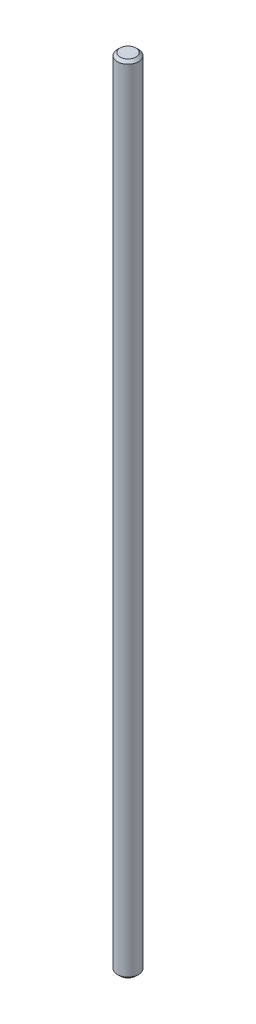
ISO-10303-21;
HEADER;
FILE_DESCRIPTION(('STEP AP214'),'2;1');
FILE_NAME('part.step','',(''),(''),'','','');
FILE_SCHEMA(('AUTOMOTIVE_DESIGN { 1 0 10303 214 1 1 1 1 }'));
ENDSEC;
DATA;
#1=APPLICATION_CONTEXT('core data for automotive mechanical design processes');
#2=APPLICATION_PROTOCOL_DEFINITION('international standard','automotive_design',2000,#1);
#3=PRODUCT_CONTEXT('',#1,'mechanical');
#4=PRODUCT('Part','Part','',(#3));
#5=PRODUCT_RELATED_PRODUCT_CATEGORY('part','',(#4));
#6=PRODUCT_DEFINITION_FORMATION('','',#4);
#7=PRODUCT_DEFINITION_CONTEXT('part definition',#1,'design');
#8=PRODUCT_DEFINITION('design','',#6,#7);
#9=PRODUCT_DEFINITION_SHAPE('','',#8);
#10=(LENGTH_UNIT() NAMED_UNIT(*) SI_UNIT(.MILLI.,.METRE.));
#11=(NAMED_UNIT(*) PLANE_ANGLE_UNIT() SI_UNIT($,.RADIAN.));
#12=(NAMED_UNIT(*) SI_UNIT($,.STERADIAN.) SOLID_ANGLE_UNIT());
#13=UNCERTAINTY_MEASURE_WITH_UNIT(LENGTH_MEASURE(1.E-05),#10,'distance_accuracy_value','');
#14=(GEOMETRIC_REPRESENTATION_CONTEXT(3) GLOBAL_UNCERTAINTY_ASSIGNED_CONTEXT((#13)) GLOBAL_UNIT_ASSIGNED_CONTEXT((#10,
#11,#12)) REPRESENTATION_CONTEXT('',''));
#15=CARTESIAN_POINT('',(0.,0.,0.));
#16=DIRECTION('',(0.,0.,1.));
#17=DIRECTION('',(1.,0.,0.));
#18=AXIS2_PLACEMENT_3D('',#15,#16,#17);
#19=CARTESIAN_POINT('',(0.,300.,0.));
#20=DIRECTION('',(0.,-1.,0.));
#21=DIRECTION('',(0.,0.,-1.));
#22=AXIS2_PLACEMENT_3D('',#19,#20,#21);
#23=CYLINDRICAL_SURFACE('',#22,4.);
#24=CARTESIAN_POINT('',(0.,1.00000000000006,0.));
#25=DIRECTION('',(0.,1.,0.));
#26=DIRECTION('',(0.,0.,1.));
#27=AXIS2_PLACEMENT_3D('',#24,#25,#26);
#28=CIRCLE('',#27,4.);
#29=CARTESIAN_POINT('',(0.,1.00000000000006,4.));
#30=VERTEX_POINT('',#29);
#31=EDGE_CURVE('E42',#30,#30,#28,.T.);
#32=ORIENTED_EDGE('',*,*,#31,.T.);
#33=EDGE_LOOP('',(#32));
#34=FACE_BOUND('',#33,.T.);
#35=CARTESIAN_POINT('',(0.,299.,0.));
#36=DIRECTION('',(0.,1.,0.));
#37=DIRECTION('',(0.,0.,1.));
#38=AXIS2_PLACEMENT_3D('',#35,#36,#37);
#39=CIRCLE('',#38,4.);
#40=CARTESIAN_POINT('',(0.,299.,4.));
#41=VERTEX_POINT('',#40);
#42=EDGE_CURVE('E46',#41,#41,#39,.F.);
#43=ORIENTED_EDGE('',*,*,#42,.T.);
#44=EDGE_LOOP('',(#43));
#45=FACE_BOUND('',#44,.T.);
#46=ADVANCED_FACE('F31',(#34,#45),#23,.T.);
#47=CARTESIAN_POINT('',(0.,300.,0.));
#48=DIRECTION('',(0.,1.,0.));
#49=DIRECTION('',(0.,0.,1.));
#50=AXIS2_PLACEMENT_3D('',#47,#48,#49);
#51=PLANE('',#50);
#52=CARTESIAN_POINT('',(0.,300.,0.));
#53=DIRECTION('',(0.,1.,0.));
#54=DIRECTION('',(0.,0.,1.));
#55=AXIS2_PLACEMENT_3D('',#52,#53,#54);
#56=CIRCLE('',#55,2.99999999999998);
#57=CARTESIAN_POINT('',(0.,300.,2.99999999999998));
#58=VERTEX_POINT('',#57);
#59=EDGE_CURVE('E10',#58,#58,#56,.T.);
#60=ORIENTED_EDGE('',*,*,#59,.T.);
#61=EDGE_LOOP('',(#60));
#62=FACE_BOUND('',#61,.T.);
#63=ADVANCED_FACE('F62',(#62),#51,.T.);
#64=CARTESIAN_POINT('',(0.,0.,0.));
#65=DIRECTION('',(0.,1.,0.));
#66=DIRECTION('',(0.,0.,1.));
#67=AXIS2_PLACEMENT_3D('',#64,#65,#66);
#68=PLANE('',#67);
#69=CARTESIAN_POINT('',(0.,0.,0.));
#70=DIRECTION('',(0.,1.,0.));
#71=DIRECTION('',(0.,0.,1.));
#72=AXIS2_PLACEMENT_3D('',#69,#70,#71);
#73=CIRCLE('',#72,2.99999999999992);
#74=CARTESIAN_POINT('',(0.,0.,2.99999999999992));
#75=VERTEX_POINT('',#74);
#76=EDGE_CURVE('E38',#75,#75,#73,.F.);
#77=ORIENTED_EDGE('',*,*,#76,.T.);
#78=EDGE_LOOP('',(#77));
#79=FACE_BOUND('',#78,.T.);
#80=ADVANCED_FACE('F59',(#79),#68,.F.);
#81=CARTESIAN_POINT('',(0.,1.00000000000006,0.));
#82=DIRECTION('',(0.,1.,0.));
#83=DIRECTION('',(0.,0.,1.));
#84=AXIS2_PLACEMENT_3D('',#81,#82,#83);
#85=CONICAL_SURFACE('',#84,4.,0.78539816339746);
#86=ORIENTED_EDGE('',*,*,#76,.F.);
#87=EDGE_LOOP('',(#86));
#88=FACE_BOUND('',#87,.T.);
#89=ORIENTED_EDGE('',*,*,#31,.F.);
#90=EDGE_LOOP('',(#89));
#91=FACE_BOUND('',#90,.T.);
#92=ADVANCED_FACE('F55',(#88,#91),#85,.T.);
#93=CARTESIAN_POINT('',(0.,300.,0.));
#94=DIRECTION('',(0.,-1.,0.));
#95=DIRECTION('',(0.,0.,-1.));
#96=AXIS2_PLACEMENT_3D('',#93,#94,#95);
#97=CONICAL_SURFACE('',#96,2.99999999999998,0.78539816339746);
#98=ORIENTED_EDGE('',*,*,#42,.F.);
#99=EDGE_LOOP('',(#98));
#100=FACE_BOUND('',#99,.T.);
#101=ORIENTED_EDGE('',*,*,#59,.F.);
#102=EDGE_LOOP('',(#101));
#103=FACE_BOUND('',#102,.T.);
#104=ADVANCED_FACE('F33',(#100,#103),#97,.T.);
#105=CLOSED_SHELL('',(#46,#63,#80,#92,#104));
#106=MANIFOLD_SOLID_BREP('B2',#105);
#107=ADVANCED_BREP_SHAPE_REPRESENTATION('',(#18,#106),#14);
#108=SHAPE_DEFINITION_REPRESENTATION(#9,#107);
ENDSEC;
END-ISO-10303-21;
